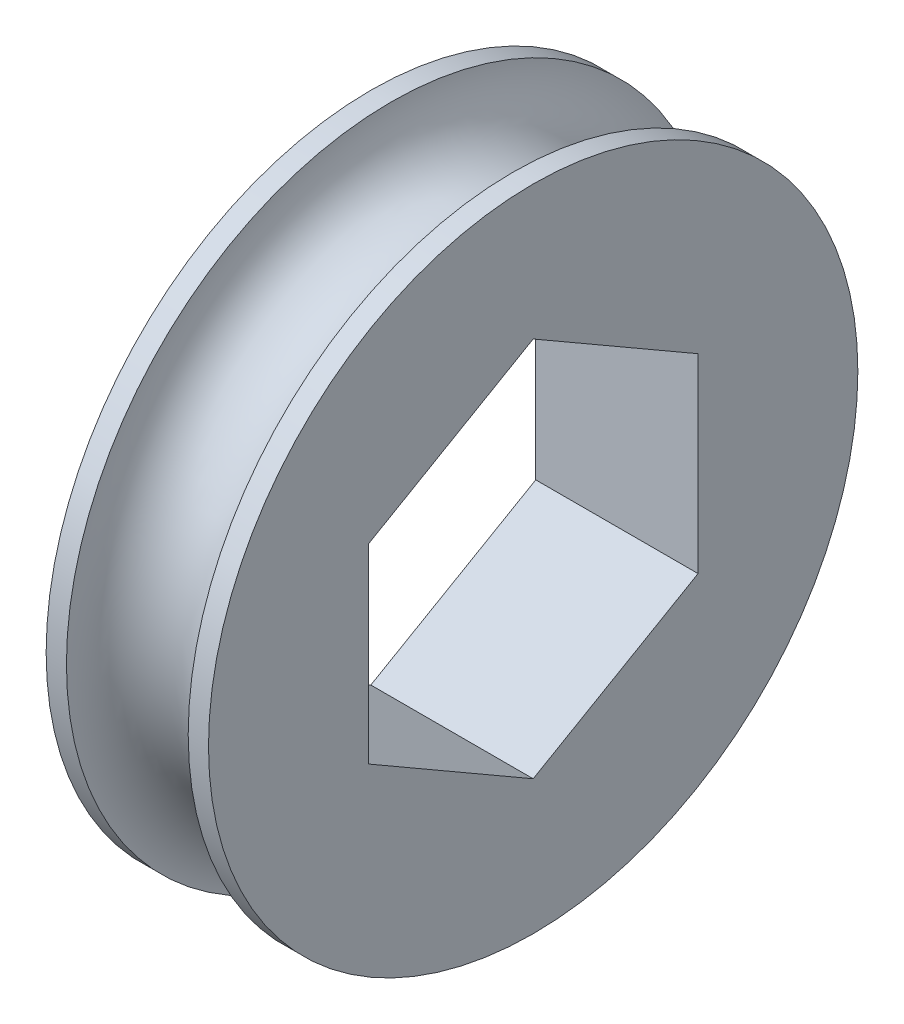
ISO-10303-21;
HEADER;
FILE_DESCRIPTION(('STEP AP214'),'2;1');
FILE_NAME('part.step','',(''),(''),'','','');
FILE_SCHEMA(('AUTOMOTIVE_DESIGN { 1 0 10303 214 1 1 1 1 }'));
ENDSEC;
DATA;
#1=APPLICATION_CONTEXT('core data for automotive mechanical design processes');
#2=APPLICATION_PROTOCOL_DEFINITION('international standard','automotive_design',2000,#1);
#3=PRODUCT_CONTEXT('',#1,'mechanical');
#4=PRODUCT('Part','Part','',(#3));
#5=PRODUCT_RELATED_PRODUCT_CATEGORY('part','',(#4));
#6=PRODUCT_DEFINITION_FORMATION('','',#4);
#7=PRODUCT_DEFINITION_CONTEXT('part definition',#1,'design');
#8=PRODUCT_DEFINITION('design','',#6,#7);
#9=PRODUCT_DEFINITION_SHAPE('','',#8);
#10=(LENGTH_UNIT() NAMED_UNIT(*) SI_UNIT(.MILLI.,.METRE.));
#11=(NAMED_UNIT(*) PLANE_ANGLE_UNIT() SI_UNIT($,.RADIAN.));
#12=(NAMED_UNIT(*) SI_UNIT($,.STERADIAN.) SOLID_ANGLE_UNIT());
#13=UNCERTAINTY_MEASURE_WITH_UNIT(LENGTH_MEASURE(1.E-05),#10,'distance_accuracy_value','');
#14=(GEOMETRIC_REPRESENTATION_CONTEXT(3) GLOBAL_UNCERTAINTY_ASSIGNED_CONTEXT((#13)) GLOBAL_UNIT_ASSIGNED_CONTEXT((#10,
#11,#12)) REPRESENTATION_CONTEXT('',''));
#15=CARTESIAN_POINT('',(0.,0.,0.));
#16=DIRECTION('',(0.,0.,1.));
#17=DIRECTION('',(1.,0.,0.));
#18=AXIS2_PLACEMENT_3D('',#15,#16,#17);
#19=CARTESIAN_POINT('',(311.15,-37.2412950776049,508.));
#20=DIRECTION('',(1.,0.,0.));
#21=DIRECTION('',(0.,1.,0.));
#22=AXIS2_PLACEMENT_3D('',#19,#20,#21);
#23=CYLINDRICAL_SURFACE('',#22,12.7);
#24=CARTESIAN_POINT('',(311.94375,-37.2412950776049,508.));
#25=DIRECTION('',(1.,0.,0.));
#26=DIRECTION('',(0.,1.,0.));
#27=AXIS2_PLACEMENT_3D('',#24,#25,#26);
#28=CIRCLE('',#27,12.7);
#29=CARTESIAN_POINT('',(311.94375,-24.5412950776049,508.));
#30=VERTEX_POINT('',#29);
#31=EDGE_CURVE('E134',#30,#30,#28,.F.);
#32=ORIENTED_EDGE('',*,*,#31,.T.);
#33=EDGE_LOOP('',(#32));
#34=FACE_BOUND('',#33,.T.);
#35=CARTESIAN_POINT('',(311.15,-37.2412950776049,508.));
#36=DIRECTION('',(-1.,0.,0.));
#37=DIRECTION('',(0.,-1.,0.));
#38=AXIS2_PLACEMENT_3D('',#35,#36,#37);
#39=CIRCLE('',#38,12.7);
#40=CARTESIAN_POINT('',(311.15,-49.9412950776048,508.));
#41=VERTEX_POINT('',#40);
#42=EDGE_CURVE('E125',#41,#41,#39,.T.);
#43=ORIENTED_EDGE('',*,*,#42,.F.);
#44=EDGE_LOOP('',(#43));
#45=FACE_BOUND('',#44,.T.);
#46=ADVANCED_FACE('F17',(#34,#45),#23,.T.);
#47=CARTESIAN_POINT('',(311.15,-147.208147538802,552.45));
#48=DIRECTION('',(-1.,0.,0.));
#49=DIRECTION('',(0.,-1.,0.));
#50=AXIS2_PLACEMENT_3D('',#47,#48,#49);
#51=PLANE('',#50);
#52=DIRECTION('',(0.,0.5,0.866025403784439));
#53=VECTOR('',#52,1.);
#54=CARTESIAN_POINT('',(311.15,-42.8271589320144,511.225));
#55=LINE('',#54,#53);
#56=CARTESIAN_POINT('',(311.15,-44.689113550151,508.));
#57=VERTEX_POINT('',#56);
#58=CARTESIAN_POINT('',(311.15,-40.9652043138779,514.45));
#59=VERTEX_POINT('',#58);
#60=EDGE_CURVE('E86',#57,#59,#55,.T.);
#61=ORIENTED_EDGE('',*,*,#60,.F.);
#62=DIRECTION('',(0.,-0.5,0.866025403784438));
#63=VECTOR('',#62,1.);
#64=CARTESIAN_POINT('',(311.15,-42.8271589320143,504.775));
#65=LINE('',#64,#63);
#66=CARTESIAN_POINT('',(311.15,-40.9652043138778,501.55));
#67=VERTEX_POINT('',#66);
#68=EDGE_CURVE('E110',#67,#57,#65,.T.);
#69=ORIENTED_EDGE('',*,*,#68,.F.);
#70=DIRECTION('',(0.,-1.,0.));
#71=VECTOR('',#70,1.);
#72=CARTESIAN_POINT('',(311.15,-37.2412950776049,501.55));
#73=LINE('',#72,#71);
#74=CARTESIAN_POINT('',(311.15,-33.5173858413318,501.55));
#75=VERTEX_POINT('',#74);
#76=EDGE_CURVE('E33',#75,#67,#73,.T.);
#77=ORIENTED_EDGE('',*,*,#76,.F.);
#78=DIRECTION('',(0.,-0.5,-0.866025403784439));
#79=VECTOR('',#78,1.);
#80=CARTESIAN_POINT('',(311.15,-31.6554312231951,504.775));
#81=LINE('',#80,#79);
#82=CARTESIAN_POINT('',(311.15,-29.7934766050587,508.));
#83=VERTEX_POINT('',#82);
#84=EDGE_CURVE('E102',#83,#75,#81,.T.);
#85=ORIENTED_EDGE('',*,*,#84,.F.);
#86=DIRECTION('',(0.,0.5,-0.866025403784439));
#87=VECTOR('',#86,1.);
#88=CARTESIAN_POINT('',(311.15,-31.6554312231953,511.225));
#89=LINE('',#88,#87);
#90=CARTESIAN_POINT('',(311.15,-33.5173858413319,514.45));
#91=VERTEX_POINT('',#90);
#92=EDGE_CURVE('E96',#91,#83,#89,.T.);
#93=ORIENTED_EDGE('',*,*,#92,.F.);
#94=DIRECTION('',(0.,1.,0.));
#95=VECTOR('',#94,1.);
#96=CARTESIAN_POINT('',(311.15,-37.2412950776049,514.45));
#97=LINE('',#96,#95);
#98=EDGE_CURVE('E77',#59,#91,#97,.T.);
#99=ORIENTED_EDGE('',*,*,#98,.F.);
#100=EDGE_LOOP('',(#61,#69,#77,#85,#93,#99));
#101=FACE_BOUND('',#100,.T.);
#102=ORIENTED_EDGE('',*,*,#42,.T.);
#103=EDGE_LOOP('',(#102));
#104=FACE_BOUND('',#103,.T.);
#105=ADVANCED_FACE('F92',(#101,#104),#51,.T.);
#106=CARTESIAN_POINT('',(314.325,-37.2412950776049,508.));
#107=DIRECTION('',(-1.,0.,0.));
#108=DIRECTION('',(0.,-1.,0.));
#109=AXIS2_PLACEMENT_3D('',#106,#107,#108);
#110=TOROIDAL_SURFACE('',#109,12.7,2.38125);
#111=CARTESIAN_POINT('',(316.70625,-37.2412950776049,508.));
#112=DIRECTION('',(-1.,0.,0.));
#113=DIRECTION('',(0.,-1.,0.));
#114=AXIS2_PLACEMENT_3D('',#111,#112,#113);
#115=CIRCLE('',#114,12.7);
#116=CARTESIAN_POINT('',(316.70625,-49.9412950776048,508.));
#117=VERTEX_POINT('',#116);
#118=EDGE_CURVE('E82',#117,#117,#115,.F.);
#119=ORIENTED_EDGE('',*,*,#118,.F.);
#120=EDGE_LOOP('',(#119));
#121=FACE_BOUND('',#120,.T.);
#122=ORIENTED_EDGE('',*,*,#31,.F.);
#123=EDGE_LOOP('',(#122));
#124=FACE_BOUND('',#123,.T.);
#125=ADVANCED_FACE('F179',(#121,#124),#110,.F.);
#126=CARTESIAN_POINT('',(317.5,-147.208147538802,552.45));
#127=DIRECTION('',(-1.,0.,0.));
#128=DIRECTION('',(0.,-1.,0.));
#129=AXIS2_PLACEMENT_3D('',#126,#127,#128);
#130=PLANE('',#129);
#131=DIRECTION('',(0.,-0.5,0.866025403784438));
#132=VECTOR('',#131,1.);
#133=CARTESIAN_POINT('',(317.5,-89.566286646423,585.729543902806));
#134=LINE('',#133,#132);
#135=CARTESIAN_POINT('',(317.5,-40.9652043138778,501.55));
#136=VERTEX_POINT('',#135);
#137=CARTESIAN_POINT('',(317.5,-44.6891135501509,508.));
#138=VERTEX_POINT('',#137);
#139=EDGE_CURVE('E129',#136,#138,#134,.T.);
#140=ORIENTED_EDGE('',*,*,#139,.T.);
#141=DIRECTION('',(0.,0.5,0.866025403784439));
#142=VECTOR('',#141,1.);
#143=CARTESIAN_POINT('',(317.5,-51.0714574482047,496.945456097194));
#144=LINE('',#143,#142);
#145=CARTESIAN_POINT('',(317.5,-40.9652043138779,514.45));
#146=VERTEX_POINT('',#145);
#147=EDGE_CURVE('E11',#138,#146,#144,.T.);
#148=ORIENTED_EDGE('',*,*,#147,.T.);
#149=DIRECTION('',(0.,1.,0.));
#150=VECTOR('',#149,1.);
#151=CARTESIAN_POINT('',(317.5,-147.208147538802,514.45));
#152=LINE('',#151,#150);
#153=CARTESIAN_POINT('',(317.5,-33.5173858413319,514.45));
#154=VERTEX_POINT('',#153);
#155=EDGE_CURVE('E26',#146,#154,#152,.T.);
#156=ORIENTED_EDGE('',*,*,#155,.T.);
#157=DIRECTION('',(0.,0.5,-0.866025403784439));
#158=VECTOR('',#157,1.);
#159=CARTESIAN_POINT('',(317.5,-78.3945589376038,592.179543902806));
#160=LINE('',#159,#158);
#161=CARTESIAN_POINT('',(317.5,-29.7934766050587,508.));
#162=VERTEX_POINT('',#161);
#163=EDGE_CURVE('E152',#154,#162,#160,.T.);
#164=ORIENTED_EDGE('',*,*,#163,.T.);
#165=DIRECTION('',(0.,-0.5,-0.866025403784439));
#166=VECTOR('',#165,1.);
#167=CARTESIAN_POINT('',(317.5,-39.8997297393855,490.495456097194));
#168=LINE('',#167,#166);
#169=CARTESIAN_POINT('',(317.5,-33.5173858413318,501.55));
#170=VERTEX_POINT('',#169);
#171=EDGE_CURVE('E148',#162,#170,#168,.T.);
#172=ORIENTED_EDGE('',*,*,#171,.T.);
#173=DIRECTION('',(0.,-1.,0.));
#174=VECTOR('',#173,1.);
#175=CARTESIAN_POINT('',(317.5,-147.208147538802,501.55));
#176=LINE('',#175,#174);
#177=EDGE_CURVE('E144',#170,#136,#176,.T.);
#178=ORIENTED_EDGE('',*,*,#177,.T.);
#179=EDGE_LOOP('',(#140,#148,#156,#164,#172,#178));
#180=FACE_BOUND('',#179,.T.);
#181=CARTESIAN_POINT('',(317.5,-37.2412950776049,508.));
#182=DIRECTION('',(-1.,0.,0.));
#183=DIRECTION('',(0.,-1.,0.));
#184=AXIS2_PLACEMENT_3D('',#181,#182,#183);
#185=CIRCLE('',#184,12.7);
#186=CARTESIAN_POINT('',(317.5,-49.9412950776048,508.));
#187=VERTEX_POINT('',#186);
#188=EDGE_CURVE('E130',#187,#187,#185,.T.);
#189=ORIENTED_EDGE('',*,*,#188,.F.);
#190=EDGE_LOOP('',(#189));
#191=FACE_BOUND('',#190,.T.);
#192=ADVANCED_FACE('F157',(#180,#191),#130,.F.);
#193=ORIENTED_EDGE('',*,*,#118,.T.);
#194=EDGE_LOOP('',(#193));
#195=FACE_BOUND('',#194,.T.);
#196=ORIENTED_EDGE('',*,*,#188,.T.);
#197=EDGE_LOOP('',(#196));
#198=FACE_BOUND('',#197,.T.);
#199=ADVANCED_FACE('F19',(#195,#198),#23,.T.);
#200=CARTESIAN_POINT('',(336.55,-42.8271589320144,511.225));
#201=DIRECTION('',(0.,-0.866025403784439,0.5));
#202=DIRECTION('',(0.,-0.5,-0.866025403784439));
#203=AXIS2_PLACEMENT_3D('',#200,#201,#202);
#204=PLANE('',#203);
#205=DIRECTION('',(-1.,0.,0.));
#206=VECTOR('',#205,1.);
#207=CARTESIAN_POINT('',(336.55,-44.689113550151,508.));
#208=LINE('',#207,#206);
#209=EDGE_CURVE('E41',#138,#57,#208,.T.);
#210=ORIENTED_EDGE('',*,*,#209,.T.);
#211=ORIENTED_EDGE('',*,*,#60,.T.);
#212=DIRECTION('',(-1.,0.,0.));
#213=VECTOR('',#212,1.);
#214=CARTESIAN_POINT('',(336.55,-40.9652043138779,514.45));
#215=LINE('',#214,#213);
#216=EDGE_CURVE('E72',#146,#59,#215,.T.);
#217=ORIENTED_EDGE('',*,*,#216,.F.);
#218=ORIENTED_EDGE('',*,*,#147,.F.);
#219=EDGE_LOOP('',(#210,#211,#217,#218));
#220=FACE_BOUND('',#219,.T.);
#221=ADVANCED_FACE('F87',(#220),#204,.F.);
#222=CARTESIAN_POINT('',(336.55,-37.2412950776049,514.45));
#223=DIRECTION('',(0.,0.,1.));
#224=DIRECTION('',(1.,0.,0.));
#225=AXIS2_PLACEMENT_3D('',#222,#223,#224);
#226=PLANE('',#225);
#227=ORIENTED_EDGE('',*,*,#216,.T.);
#228=ORIENTED_EDGE('',*,*,#98,.T.);
#229=DIRECTION('',(-1.,0.,0.));
#230=VECTOR('',#229,1.);
#231=CARTESIAN_POINT('',(336.55,-33.5173858413319,514.45));
#232=LINE('',#231,#230);
#233=EDGE_CURVE('E83',#154,#91,#232,.T.);
#234=ORIENTED_EDGE('',*,*,#233,.F.);
#235=ORIENTED_EDGE('',*,*,#155,.F.);
#236=EDGE_LOOP('',(#227,#228,#234,#235));
#237=FACE_BOUND('',#236,.T.);
#238=ADVANCED_FACE('F74',(#237),#226,.F.);
#239=CARTESIAN_POINT('',(336.55,-31.6554312231953,511.225));
#240=DIRECTION('',(0.,0.866025403784439,0.5));
#241=DIRECTION('',(0.,-0.5,0.866025403784439));
#242=AXIS2_PLACEMENT_3D('',#239,#240,#241);
#243=PLANE('',#242);
#244=ORIENTED_EDGE('',*,*,#233,.T.);
#245=ORIENTED_EDGE('',*,*,#92,.T.);
#246=DIRECTION('',(-1.,0.,0.));
#247=VECTOR('',#246,1.);
#248=CARTESIAN_POINT('',(336.55,-29.7934766050587,508.));
#249=LINE('',#248,#247);
#250=EDGE_CURVE('E120',#162,#83,#249,.T.);
#251=ORIENTED_EDGE('',*,*,#250,.F.);
#252=ORIENTED_EDGE('',*,*,#163,.F.);
#253=EDGE_LOOP('',(#244,#245,#251,#252));
#254=FACE_BOUND('',#253,.T.);
#255=ADVANCED_FACE('F166',(#254),#243,.F.);
#256=CARTESIAN_POINT('',(336.55,-31.6554312231952,504.775));
#257=DIRECTION('',(0.,0.866025403784439,-0.5));
#258=DIRECTION('',(0.,0.5,0.866025403784439));
#259=AXIS2_PLACEMENT_3D('',#256,#257,#258);
#260=PLANE('',#259);
#261=ORIENTED_EDGE('',*,*,#250,.T.);
#262=ORIENTED_EDGE('',*,*,#84,.T.);
#263=DIRECTION('',(-1.,0.,0.));
#264=VECTOR('',#263,1.);
#265=CARTESIAN_POINT('',(336.55,-33.5173858413318,501.55));
#266=LINE('',#265,#264);
#267=EDGE_CURVE('E117',#170,#75,#266,.T.);
#268=ORIENTED_EDGE('',*,*,#267,.F.);
#269=ORIENTED_EDGE('',*,*,#171,.F.);
#270=EDGE_LOOP('',(#261,#262,#268,#269));
#271=FACE_BOUND('',#270,.T.);
#272=ADVANCED_FACE('F163',(#271),#260,.F.);
#273=CARTESIAN_POINT('',(336.55,-37.2412950776049,501.55));
#274=DIRECTION('',(0.,0.,-1.));
#275=DIRECTION('',(-1.,0.,0.));
#276=AXIS2_PLACEMENT_3D('',#273,#274,#275);
#277=PLANE('',#276);
#278=ORIENTED_EDGE('',*,*,#267,.T.);
#279=ORIENTED_EDGE('',*,*,#76,.T.);
#280=DIRECTION('',(-1.,0.,0.));
#281=VECTOR('',#280,1.);
#282=CARTESIAN_POINT('',(336.55,-40.9652043138778,501.55));
#283=LINE('',#282,#281);
#284=EDGE_CURVE('E115',#136,#67,#283,.T.);
#285=ORIENTED_EDGE('',*,*,#284,.F.);
#286=ORIENTED_EDGE('',*,*,#177,.F.);
#287=EDGE_LOOP('',(#278,#279,#285,#286));
#288=FACE_BOUND('',#287,.T.);
#289=ADVANCED_FACE('F160',(#288),#277,.F.);
#290=CARTESIAN_POINT('',(336.55,-42.8271589320143,504.775));
#291=DIRECTION('',(0.,-0.866025403784438,-0.5));
#292=DIRECTION('',(0.,0.5,-0.866025403784438));
#293=AXIS2_PLACEMENT_3D('',#290,#291,#292);
#294=PLANE('',#293);
#295=ORIENTED_EDGE('',*,*,#284,.T.);
#296=ORIENTED_EDGE('',*,*,#68,.T.);
#297=ORIENTED_EDGE('',*,*,#209,.F.);
#298=ORIENTED_EDGE('',*,*,#139,.F.);
#299=EDGE_LOOP('',(#295,#296,#297,#298));
#300=FACE_BOUND('',#299,.T.);
#301=ADVANCED_FACE('F159',(#300),#294,.F.);
#302=CLOSED_SHELL('',(#46,#105,#125,#192,#199,#221,#238,#255,#272,#289,#301));
#303=MANIFOLD_SOLID_BREP('B1',#302);
#304=ADVANCED_BREP_SHAPE_REPRESENTATION('',(#18,#303),#14);
#305=SHAPE_DEFINITION_REPRESENTATION(#9,#304);
ENDSEC;
END-ISO-10303-21;
